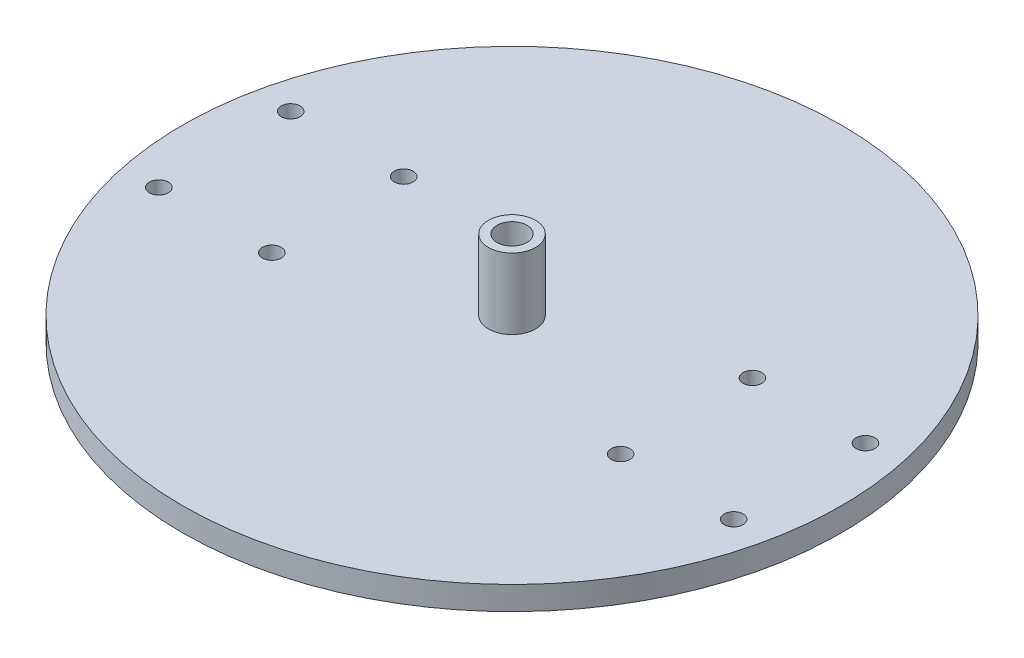
ISO-10303-21;
HEADER;
FILE_DESCRIPTION(('STEP AP214'),'2;1');
FILE_NAME('part.step','',(''),(''),'','','');
FILE_SCHEMA(('AUTOMOTIVE_DESIGN { 1 0 10303 214 1 1 1 1 }'));
ENDSEC;
DATA;
#1=APPLICATION_CONTEXT('core data for automotive mechanical design processes');
#2=APPLICATION_PROTOCOL_DEFINITION('international standard','automotive_design',2000,#1);
#3=PRODUCT_CONTEXT('',#1,'mechanical');
#4=PRODUCT('Part','Part','',(#3));
#5=PRODUCT_RELATED_PRODUCT_CATEGORY('part','',(#4));
#6=PRODUCT_DEFINITION_FORMATION('','',#4);
#7=PRODUCT_DEFINITION_CONTEXT('part definition',#1,'design');
#8=PRODUCT_DEFINITION('design','',#6,#7);
#9=PRODUCT_DEFINITION_SHAPE('','',#8);
#10=(LENGTH_UNIT() NAMED_UNIT(*) SI_UNIT(.MILLI.,.METRE.));
#11=(NAMED_UNIT(*) PLANE_ANGLE_UNIT() SI_UNIT($,.RADIAN.));
#12=(NAMED_UNIT(*) SI_UNIT($,.STERADIAN.) SOLID_ANGLE_UNIT());
#13=UNCERTAINTY_MEASURE_WITH_UNIT(LENGTH_MEASURE(1.E-05),#10,'distance_accuracy_value','');
#14=(GEOMETRIC_REPRESENTATION_CONTEXT(3) GLOBAL_UNCERTAINTY_ASSIGNED_CONTEXT((#13)) GLOBAL_UNIT_ASSIGNED_CONTEXT((#10,
#11,#12)) REPRESENTATION_CONTEXT('',''));
#15=CARTESIAN_POINT('',(0.,0.,0.));
#16=DIRECTION('',(0.,0.,1.));
#17=DIRECTION('',(1.,0.,0.));
#18=AXIS2_PLACEMENT_3D('',#15,#16,#17);
#19=CARTESIAN_POINT('',(0.,5.,0.));
#20=DIRECTION('',(0.,1.,0.));
#21=DIRECTION('',(0.,0.,1.));
#22=AXIS2_PLACEMENT_3D('',#19,#20,#21);
#23=PLANE('',#22);
#24=CARTESIAN_POINT('',(61.0417595086949,5.,13.9667813046783));
#25=DIRECTION('',(0.,1.,0.));
#26=DIRECTION('',(0.,0.,1.));
#27=AXIS2_PLACEMENT_3D('',#24,#25,#26);
#28=CIRCLE('',#27,2.);
#29=CARTESIAN_POINT('',(61.0417595086949,5.,15.9667813046783));
#30=VERTEX_POINT('',#29);
#31=EDGE_CURVE('E104',#30,#30,#28,.F.);
#32=ORIENTED_EDGE('',*,*,#31,.T.);
#33=EDGE_LOOP('',(#32));
#34=FACE_BOUND('',#33,.T.);
#35=CARTESIAN_POINT('',(61.0417595086943,5.,-14.0332186953217));
#36=DIRECTION('',(0.,1.,0.));
#37=DIRECTION('',(0.,0.,1.));
#38=AXIS2_PLACEMENT_3D('',#35,#36,#37);
#39=CIRCLE('',#38,2.);
#40=CARTESIAN_POINT('',(61.0417595086943,5.,-12.0332186953217));
#41=VERTEX_POINT('',#40);
#42=EDGE_CURVE('E99',#41,#41,#39,.F.);
#43=ORIENTED_EDGE('',*,*,#42,.T.);
#44=EDGE_LOOP('',(#43));
#45=FACE_BOUND('',#44,.T.);
#46=CARTESIAN_POINT('',(-61.0417595086943,5.,-14.0332186953217));
#47=DIRECTION('',(0.,1.,0.));
#48=DIRECTION('',(0.,0.,1.));
#49=AXIS2_PLACEMENT_3D('',#46,#47,#48);
#50=CIRCLE('',#49,2.);
#51=CARTESIAN_POINT('',(-61.0417595086943,5.,-12.0332186953217));
#52=VERTEX_POINT('',#51);
#53=EDGE_CURVE('E62',#52,#52,#50,.T.);
#54=ORIENTED_EDGE('',*,*,#53,.F.);
#55=EDGE_LOOP('',(#54));
#56=FACE_BOUND('',#55,.T.);
#57=CARTESIAN_POINT('',(0.,5.,0.));
#58=DIRECTION('',(0.,1.,0.));
#59=DIRECTION('',(0.,0.,1.));
#60=AXIS2_PLACEMENT_3D('',#57,#58,#59);
#61=CIRCLE('',#60,70.);
#62=CARTESIAN_POINT('',(0.,5.,70.));
#63=VERTEX_POINT('',#62);
#64=EDGE_CURVE('E10',#63,#63,#61,.T.);
#65=ORIENTED_EDGE('',*,*,#64,.T.);
#66=EDGE_LOOP('',(#65));
#67=FACE_BOUND('',#66,.T.);
#68=CARTESIAN_POINT('',(0.,5.,0.));
#69=DIRECTION('',(0.,1.,0.));
#70=DIRECTION('',(0.,0.,1.));
#71=AXIS2_PLACEMENT_3D('',#68,#69,#70);
#72=CIRCLE('',#71,5.);
#73=CARTESIAN_POINT('',(0.,5.,5.));
#74=VERTEX_POINT('',#73);
#75=EDGE_CURVE('E53',#74,#74,#72,.T.);
#76=ORIENTED_EDGE('',*,*,#75,.F.);
#77=EDGE_LOOP('',(#76));
#78=FACE_BOUND('',#77,.T.);
#79=CARTESIAN_POINT('',(37.0417595086949,5.,13.9667813046753));
#80=DIRECTION('',(0.,1.,0.));
#81=DIRECTION('',(0.,0.,1.));
#82=AXIS2_PLACEMENT_3D('',#79,#80,#81);
#83=CIRCLE('',#82,2.);
#84=CARTESIAN_POINT('',(37.0417595086949,5.,15.9667813046753));
#85=VERTEX_POINT('',#84);
#86=EDGE_CURVE('E92',#85,#85,#83,.F.);
#87=ORIENTED_EDGE('',*,*,#86,.T.);
#88=EDGE_LOOP('',(#87));
#89=FACE_BOUND('',#88,.T.);
#90=CARTESIAN_POINT('',(-37.0417595086943,5.,-14.0332186953212));
#91=DIRECTION('',(0.,1.,0.));
#92=DIRECTION('',(0.,0.,1.));
#93=AXIS2_PLACEMENT_3D('',#90,#91,#92);
#94=CIRCLE('',#93,2.);
#95=CARTESIAN_POINT('',(-37.0417595086943,5.,-12.0332186953212));
#96=VERTEX_POINT('',#95);
#97=EDGE_CURVE('E75',#96,#96,#94,.T.);
#98=ORIENTED_EDGE('',*,*,#97,.F.);
#99=EDGE_LOOP('',(#98));
#100=FACE_BOUND('',#99,.T.);
#101=CARTESIAN_POINT('',(-61.0417595086949,5.,13.9667813046783));
#102=DIRECTION('',(0.,1.,0.));
#103=DIRECTION('',(0.,0.,1.));
#104=AXIS2_PLACEMENT_3D('',#101,#102,#103);
#105=CIRCLE('',#104,2.);
#106=CARTESIAN_POINT('',(-61.0417595086949,5.,15.9667813046783));
#107=VERTEX_POINT('',#106);
#108=EDGE_CURVE('E68',#107,#107,#105,.T.);
#109=ORIENTED_EDGE('',*,*,#108,.F.);
#110=EDGE_LOOP('',(#109));
#111=FACE_BOUND('',#110,.T.);
#112=CARTESIAN_POINT('',(-37.0417595086949,5.,13.9667813046753));
#113=DIRECTION('',(0.,1.,0.));
#114=DIRECTION('',(0.,0.,1.));
#115=AXIS2_PLACEMENT_3D('',#112,#113,#114);
#116=CIRCLE('',#115,2.);
#117=CARTESIAN_POINT('',(-37.0417595086949,5.,15.9667813046753));
#118=VERTEX_POINT('',#117);
#119=EDGE_CURVE('E87',#118,#118,#116,.T.);
#120=ORIENTED_EDGE('',*,*,#119,.F.);
#121=EDGE_LOOP('',(#120));
#122=FACE_BOUND('',#121,.T.);
#123=CARTESIAN_POINT('',(37.0417595086943,5.,-14.0332186953212));
#124=DIRECTION('',(0.,1.,0.));
#125=DIRECTION('',(0.,0.,1.));
#126=AXIS2_PLACEMENT_3D('',#123,#124,#125);
#127=CIRCLE('',#126,2.);
#128=CARTESIAN_POINT('',(37.0417595086943,5.,-12.0332186953212));
#129=VERTEX_POINT('',#128);
#130=EDGE_CURVE('E80',#129,#129,#127,.F.);
#131=ORIENTED_EDGE('',*,*,#130,.T.);
#132=EDGE_LOOP('',(#131));
#133=FACE_BOUND('',#132,.T.);
#134=ADVANCED_FACE('F37',(#34,#45,#56,#67,#78,#89,#100,#111,#122,#133),#23,.T.);
#135=CARTESIAN_POINT('',(0.,0.,0.));
#136=DIRECTION('',(0.,1.,0.));
#137=DIRECTION('',(0.,0.,1.));
#138=AXIS2_PLACEMENT_3D('',#135,#136,#137);
#139=PLANE('',#138);
#140=CARTESIAN_POINT('',(-37.0417595086949,0.,13.9667813046753));
#141=DIRECTION('',(0.,1.,0.));
#142=DIRECTION('',(0.,0.,1.));
#143=AXIS2_PLACEMENT_3D('',#140,#141,#142);
#144=CIRCLE('',#143,2.);
#145=CARTESIAN_POINT('',(-37.0417595086949,0.,15.9667813046753));
#146=VERTEX_POINT('',#145);
#147=EDGE_CURVE('E72',#146,#146,#144,.T.);
#148=ORIENTED_EDGE('',*,*,#147,.T.);
#149=EDGE_LOOP('',(#148));
#150=FACE_BOUND('',#149,.T.);
#151=CARTESIAN_POINT('',(-61.0417595086949,0.,13.9667813046783));
#152=DIRECTION('',(0.,1.,0.));
#153=DIRECTION('',(0.,0.,1.));
#154=AXIS2_PLACEMENT_3D('',#151,#152,#153);
#155=CIRCLE('',#154,2.);
#156=CARTESIAN_POINT('',(-61.0417595086949,0.,15.9667813046783));
#157=VERTEX_POINT('',#156);
#158=EDGE_CURVE('E71',#157,#157,#155,.T.);
#159=ORIENTED_EDGE('',*,*,#158,.T.);
#160=EDGE_LOOP('',(#159));
#161=FACE_BOUND('',#160,.T.);
#162=CARTESIAN_POINT('',(-37.0417595086943,0.,-14.0332186953212));
#163=DIRECTION('',(0.,1.,0.));
#164=DIRECTION('',(0.,0.,1.));
#165=AXIS2_PLACEMENT_3D('',#162,#163,#164);
#166=CIRCLE('',#165,2.);
#167=CARTESIAN_POINT('',(-37.0417595086943,0.,-12.0332186953212));
#168=VERTEX_POINT('',#167);
#169=EDGE_CURVE('E65',#168,#168,#166,.T.);
#170=ORIENTED_EDGE('',*,*,#169,.T.);
#171=EDGE_LOOP('',(#170));
#172=FACE_BOUND('',#171,.T.);
#173=CARTESIAN_POINT('',(-61.0417595086943,0.,-14.0332186953217));
#174=DIRECTION('',(0.,1.,0.));
#175=DIRECTION('',(0.,0.,1.));
#176=AXIS2_PLACEMENT_3D('',#173,#174,#175);
#177=CIRCLE('',#176,2.);
#178=CARTESIAN_POINT('',(-61.0417595086943,0.,-12.0332186953217));
#179=VERTEX_POINT('',#178);
#180=EDGE_CURVE('E61',#179,#179,#177,.T.);
#181=ORIENTED_EDGE('',*,*,#180,.T.);
#182=EDGE_LOOP('',(#181));
#183=FACE_BOUND('',#182,.T.);
#184=CARTESIAN_POINT('',(0.,0.,0.));
#185=DIRECTION('',(0.,1.,0.));
#186=DIRECTION('',(0.,0.,1.));
#187=AXIS2_PLACEMENT_3D('',#184,#185,#186);
#188=CIRCLE('',#187,70.);
#189=CARTESIAN_POINT('',(0.,0.,70.));
#190=VERTEX_POINT('',#189);
#191=EDGE_CURVE('E41',#190,#190,#188,.T.);
#192=ORIENTED_EDGE('',*,*,#191,.F.);
#193=EDGE_LOOP('',(#192));
#194=FACE_BOUND('',#193,.T.);
#195=CARTESIAN_POINT('',(0.,0.,0.));
#196=DIRECTION('',(0.,1.,0.));
#197=DIRECTION('',(0.,0.,1.));
#198=AXIS2_PLACEMENT_3D('',#195,#196,#197);
#199=CIRCLE('',#198,3.175);
#200=CARTESIAN_POINT('',(0.,0.,3.175));
#201=VERTEX_POINT('',#200);
#202=EDGE_CURVE('E48',#201,#201,#199,.T.);
#203=ORIENTED_EDGE('',*,*,#202,.T.);
#204=EDGE_LOOP('',(#203));
#205=FACE_BOUND('',#204,.T.);
#206=CARTESIAN_POINT('',(61.0417595086943,0.,-14.0332186953217));
#207=DIRECTION('',(0.,1.,0.));
#208=DIRECTION('',(0.,0.,1.));
#209=AXIS2_PLACEMENT_3D('',#206,#207,#208);
#210=CIRCLE('',#209,2.);
#211=CARTESIAN_POINT('',(61.0417595086943,0.,-12.0332186953217));
#212=VERTEX_POINT('',#211);
#213=EDGE_CURVE('E84',#212,#212,#210,.F.);
#214=ORIENTED_EDGE('',*,*,#213,.F.);
#215=EDGE_LOOP('',(#214));
#216=FACE_BOUND('',#215,.T.);
#217=CARTESIAN_POINT('',(37.0417595086949,0.,13.9667813046753));
#218=DIRECTION('',(0.,1.,0.));
#219=DIRECTION('',(0.,0.,1.));
#220=AXIS2_PLACEMENT_3D('',#217,#218,#219);
#221=CIRCLE('',#220,2.);
#222=CARTESIAN_POINT('',(37.0417595086949,0.,15.9667813046753));
#223=VERTEX_POINT('',#222);
#224=EDGE_CURVE('E95',#223,#223,#221,.F.);
#225=ORIENTED_EDGE('',*,*,#224,.F.);
#226=EDGE_LOOP('',(#225));
#227=FACE_BOUND('',#226,.T.);
#228=CARTESIAN_POINT('',(61.0417595086949,0.,13.9667813046783));
#229=DIRECTION('',(0.,1.,0.));
#230=DIRECTION('',(0.,0.,1.));
#231=AXIS2_PLACEMENT_3D('',#228,#229,#230);
#232=CIRCLE('',#231,2.);
#233=CARTESIAN_POINT('',(61.0417595086949,0.,15.9667813046783));
#234=VERTEX_POINT('',#233);
#235=EDGE_CURVE('E96',#234,#234,#232,.F.);
#236=ORIENTED_EDGE('',*,*,#235,.F.);
#237=EDGE_LOOP('',(#236));
#238=FACE_BOUND('',#237,.T.);
#239=CARTESIAN_POINT('',(37.0417595086943,0.,-14.0332186953212));
#240=DIRECTION('',(0.,1.,0.));
#241=DIRECTION('',(0.,0.,1.));
#242=AXIS2_PLACEMENT_3D('',#239,#240,#241);
#243=CIRCLE('',#242,2.);
#244=CARTESIAN_POINT('',(37.0417595086943,0.,-12.0332186953212));
#245=VERTEX_POINT('',#244);
#246=EDGE_CURVE('E83',#245,#245,#243,.F.);
#247=ORIENTED_EDGE('',*,*,#246,.F.);
#248=EDGE_LOOP('',(#247));
#249=FACE_BOUND('',#248,.T.);
#250=ADVANCED_FACE('F113',(#150,#161,#172,#183,#194,#205,#216,#227,#238,#249),#139,.F.);
#251=CARTESIAN_POINT('',(0.,5.,0.));
#252=DIRECTION('',(0.,-1.,0.));
#253=DIRECTION('',(0.,0.,-1.));
#254=AXIS2_PLACEMENT_3D('',#251,#252,#253);
#255=CYLINDRICAL_SURFACE('',#254,70.);
#256=ORIENTED_EDGE('',*,*,#64,.F.);
#257=EDGE_LOOP('',(#256));
#258=FACE_BOUND('',#257,.T.);
#259=ORIENTED_EDGE('',*,*,#191,.T.);
#260=EDGE_LOOP('',(#259));
#261=FACE_BOUND('',#260,.T.);
#262=ADVANCED_FACE('F39',(#258,#261),#255,.T.);
#263=CARTESIAN_POINT('',(0.,5.,0.));
#264=DIRECTION('',(0.,-1.,0.));
#265=DIRECTION('',(0.,0.,-1.));
#266=AXIS2_PLACEMENT_3D('',#263,#264,#265);
#267=CYLINDRICAL_SURFACE('',#266,3.175);
#268=ORIENTED_EDGE('',*,*,#202,.F.);
#269=EDGE_LOOP('',(#268));
#270=FACE_BOUND('',#269,.T.);
#271=CARTESIAN_POINT('',(0.,20.,0.));
#272=DIRECTION('',(0.,1.,0.));
#273=DIRECTION('',(0.,0.,1.));
#274=AXIS2_PLACEMENT_3D('',#271,#272,#273);
#275=CIRCLE('',#274,3.175);
#276=CARTESIAN_POINT('',(0.,20.,3.175));
#277=VERTEX_POINT('',#276);
#278=EDGE_CURVE('E56',#277,#277,#275,.T.);
#279=ORIENTED_EDGE('',*,*,#278,.T.);
#280=EDGE_LOOP('',(#279));
#281=FACE_BOUND('',#280,.T.);
#282=ADVANCED_FACE('F134',(#270,#281),#267,.F.);
#283=CARTESIAN_POINT('',(0.,20.,0.));
#284=DIRECTION('',(0.,1.,0.));
#285=DIRECTION('',(0.,0.,1.));
#286=AXIS2_PLACEMENT_3D('',#283,#284,#285);
#287=PLANE('',#286);
#288=CARTESIAN_POINT('',(0.,20.,0.));
#289=DIRECTION('',(0.,1.,0.));
#290=DIRECTION('',(0.,0.,1.));
#291=AXIS2_PLACEMENT_3D('',#288,#289,#290);
#292=CIRCLE('',#291,5.);
#293=CARTESIAN_POINT('',(0.,20.,5.));
#294=VERTEX_POINT('',#293);
#295=EDGE_CURVE('E52',#294,#294,#292,.T.);
#296=ORIENTED_EDGE('',*,*,#295,.T.);
#297=EDGE_LOOP('',(#296));
#298=FACE_BOUND('',#297,.T.);
#299=ORIENTED_EDGE('',*,*,#278,.F.);
#300=EDGE_LOOP('',(#299));
#301=FACE_BOUND('',#300,.T.);
#302=ADVANCED_FACE('F137',(#298,#301),#287,.T.);
#303=CARTESIAN_POINT('',(0.,20.,0.));
#304=DIRECTION('',(0.,-1.,0.));
#305=DIRECTION('',(0.,0.,-1.));
#306=AXIS2_PLACEMENT_3D('',#303,#304,#305);
#307=CYLINDRICAL_SURFACE('',#306,5.);
#308=ORIENTED_EDGE('',*,*,#295,.F.);
#309=EDGE_LOOP('',(#308));
#310=FACE_BOUND('',#309,.T.);
#311=ORIENTED_EDGE('',*,*,#75,.T.);
#312=EDGE_LOOP('',(#311));
#313=FACE_BOUND('',#312,.T.);
#314=ADVANCED_FACE('F139',(#310,#313),#307,.T.);
#315=CARTESIAN_POINT('',(-61.0417595086943,0.,-14.0332186953217));
#316=DIRECTION('',(0.,1.,0.));
#317=DIRECTION('',(0.,0.,1.));
#318=AXIS2_PLACEMENT_3D('',#315,#316,#317);
#319=CYLINDRICAL_SURFACE('',#318,2.);
#320=ORIENTED_EDGE('',*,*,#180,.F.);
#321=EDGE_LOOP('',(#320));
#322=FACE_BOUND('',#321,.T.);
#323=ORIENTED_EDGE('',*,*,#53,.T.);
#324=EDGE_LOOP('',(#323));
#325=FACE_BOUND('',#324,.T.);
#326=ADVANCED_FACE('F141',(#322,#325),#319,.F.);
#327=CARTESIAN_POINT('',(61.0417595086943,0.,-14.0332186953217));
#328=DIRECTION('',(0.,1.,0.));
#329=DIRECTION('',(0.,0.,1.));
#330=AXIS2_PLACEMENT_3D('',#327,#328,#329);
#331=CYLINDRICAL_SURFACE('',#330,2.);
#332=ORIENTED_EDGE('',*,*,#213,.T.);
#333=EDGE_LOOP('',(#332));
#334=FACE_BOUND('',#333,.T.);
#335=ORIENTED_EDGE('',*,*,#42,.F.);
#336=EDGE_LOOP('',(#335));
#337=FACE_BOUND('',#336,.T.);
#338=ADVANCED_FACE('F148',(#334,#337),#331,.F.);
#339=CARTESIAN_POINT('',(37.0417595086949,0.,13.9667813046753));
#340=DIRECTION('',(0.,1.,0.));
#341=DIRECTION('',(0.,0.,1.));
#342=AXIS2_PLACEMENT_3D('',#339,#340,#341);
#343=CYLINDRICAL_SURFACE('',#342,2.);
#344=ORIENTED_EDGE('',*,*,#224,.T.);
#345=EDGE_LOOP('',(#344));
#346=FACE_BOUND('',#345,.T.);
#347=ORIENTED_EDGE('',*,*,#86,.F.);
#348=EDGE_LOOP('',(#347));
#349=FACE_BOUND('',#348,.T.);
#350=ADVANCED_FACE('F161',(#346,#349),#343,.F.);
#351=CARTESIAN_POINT('',(61.0417595086949,0.,13.9667813046783));
#352=DIRECTION('',(0.,1.,0.));
#353=DIRECTION('',(0.,0.,1.));
#354=AXIS2_PLACEMENT_3D('',#351,#352,#353);
#355=CYLINDRICAL_SURFACE('',#354,2.);
#356=ORIENTED_EDGE('',*,*,#235,.T.);
#357=EDGE_LOOP('',(#356));
#358=FACE_BOUND('',#357,.T.);
#359=ORIENTED_EDGE('',*,*,#31,.F.);
#360=EDGE_LOOP('',(#359));
#361=FACE_BOUND('',#360,.T.);
#362=ADVANCED_FACE('F110',(#358,#361),#355,.F.);
#363=CARTESIAN_POINT('',(-37.0417595086943,0.,-14.0332186953212));
#364=DIRECTION('',(0.,1.,0.));
#365=DIRECTION('',(0.,0.,1.));
#366=AXIS2_PLACEMENT_3D('',#363,#364,#365);
#367=CYLINDRICAL_SURFACE('',#366,2.);
#368=ORIENTED_EDGE('',*,*,#169,.F.);
#369=EDGE_LOOP('',(#368));
#370=FACE_BOUND('',#369,.T.);
#371=ORIENTED_EDGE('',*,*,#97,.T.);
#372=EDGE_LOOP('',(#371));
#373=FACE_BOUND('',#372,.T.);
#374=ADVANCED_FACE('F153',(#370,#373),#367,.F.);
#375=CARTESIAN_POINT('',(-61.0417595086949,0.,13.9667813046783));
#376=DIRECTION('',(0.,1.,0.));
#377=DIRECTION('',(0.,0.,1.));
#378=AXIS2_PLACEMENT_3D('',#375,#376,#377);
#379=CYLINDRICAL_SURFACE('',#378,2.);
#380=ORIENTED_EDGE('',*,*,#158,.F.);
#381=EDGE_LOOP('',(#380));
#382=FACE_BOUND('',#381,.T.);
#383=ORIENTED_EDGE('',*,*,#108,.T.);
#384=EDGE_LOOP('',(#383));
#385=FACE_BOUND('',#384,.T.);
#386=ADVANCED_FACE('F150',(#382,#385),#379,.F.);
#387=CARTESIAN_POINT('',(-37.0417595086949,0.,13.9667813046753));
#388=DIRECTION('',(0.,1.,0.));
#389=DIRECTION('',(0.,0.,1.));
#390=AXIS2_PLACEMENT_3D('',#387,#388,#389);
#391=CYLINDRICAL_SURFACE('',#390,2.);
#392=ORIENTED_EDGE('',*,*,#147,.F.);
#393=EDGE_LOOP('',(#392));
#394=FACE_BOUND('',#393,.T.);
#395=ORIENTED_EDGE('',*,*,#119,.T.);
#396=EDGE_LOOP('',(#395));
#397=FACE_BOUND('',#396,.T.);
#398=ADVANCED_FACE('F122',(#394,#397),#391,.F.);
#399=CARTESIAN_POINT('',(37.0417595086943,0.,-14.0332186953212));
#400=DIRECTION('',(0.,1.,0.));
#401=DIRECTION('',(0.,0.,1.));
#402=AXIS2_PLACEMENT_3D('',#399,#400,#401);
#403=CYLINDRICAL_SURFACE('',#402,2.);
#404=ORIENTED_EDGE('',*,*,#246,.T.);
#405=EDGE_LOOP('',(#404));
#406=FACE_BOUND('',#405,.T.);
#407=ORIENTED_EDGE('',*,*,#130,.F.);
#408=EDGE_LOOP('',(#407));
#409=FACE_BOUND('',#408,.T.);
#410=ADVANCED_FACE('F119',(#406,#409),#403,.F.);
#411=CLOSED_SHELL('',(#134,#250,#262,#282,#302,#314,#326,#338,#350,#362,#374,#386,#398,#410));
#412=MANIFOLD_SOLID_BREP('B2',#411);
#413=ADVANCED_BREP_SHAPE_REPRESENTATION('',(#18,#412),#14);
#414=SHAPE_DEFINITION_REPRESENTATION(#9,#413);
ENDSEC;
END-ISO-10303-21;
